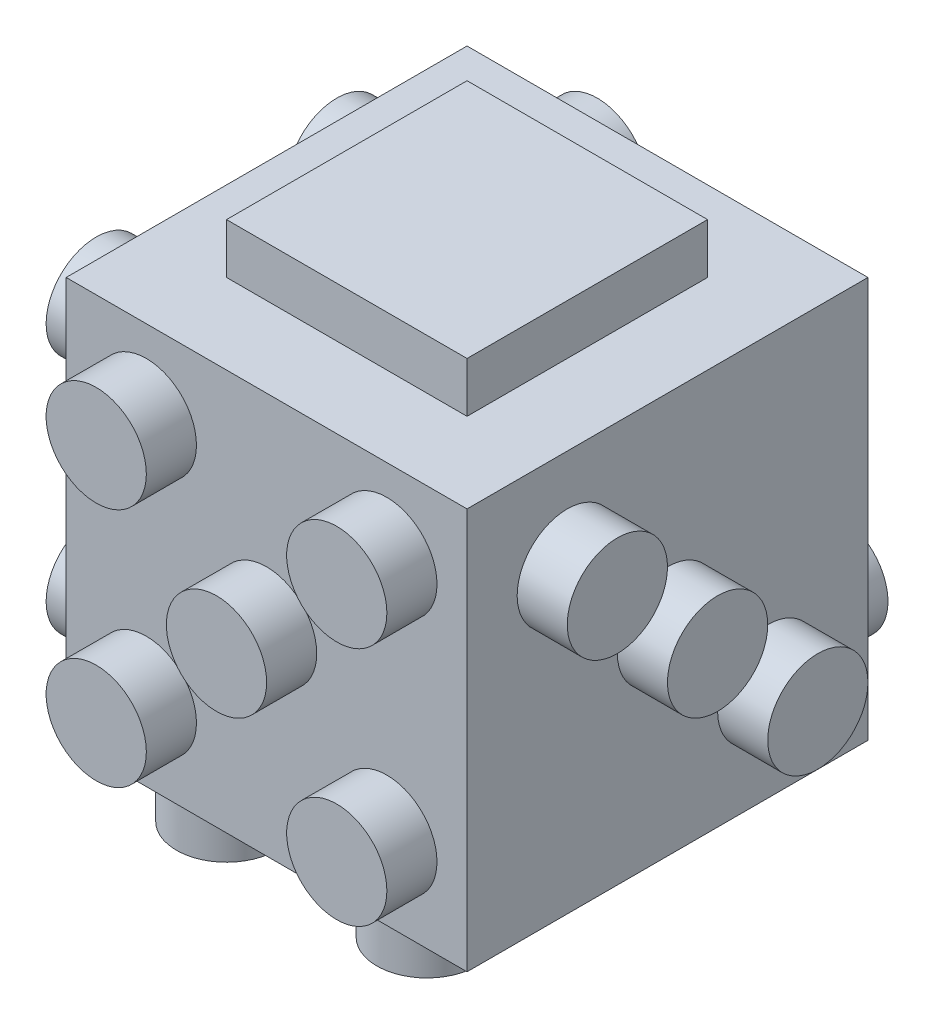
ISO-10303-21;
HEADER;
FILE_DESCRIPTION(('STEP AP214'),'2;1');
FILE_NAME('part.step','',(''),(''),'','','');
FILE_SCHEMA(('AUTOMOTIVE_DESIGN { 1 0 10303 214 1 1 1 1 }'));
ENDSEC;
DATA;
#1=APPLICATION_CONTEXT('core data for automotive mechanical design processes');
#2=APPLICATION_PROTOCOL_DEFINITION('international standard','automotive_design',2000,#1);
#3=PRODUCT_CONTEXT('',#1,'mechanical');
#4=PRODUCT('Part','Part','',(#3));
#5=PRODUCT_RELATED_PRODUCT_CATEGORY('part','',(#4));
#6=PRODUCT_DEFINITION_FORMATION('','',#4);
#7=PRODUCT_DEFINITION_CONTEXT('part definition',#1,'design');
#8=PRODUCT_DEFINITION('design','',#6,#7);
#9=PRODUCT_DEFINITION_SHAPE('','',#8);
#10=(LENGTH_UNIT() NAMED_UNIT(*) SI_UNIT(.MILLI.,.METRE.));
#11=(NAMED_UNIT(*) PLANE_ANGLE_UNIT() SI_UNIT($,.RADIAN.));
#12=(NAMED_UNIT(*) SI_UNIT($,.STERADIAN.) SOLID_ANGLE_UNIT());
#13=UNCERTAINTY_MEASURE_WITH_UNIT(LENGTH_MEASURE(1.E-05),#10,'distance_accuracy_value','');
#14=(GEOMETRIC_REPRESENTATION_CONTEXT(3) GLOBAL_UNCERTAINTY_ASSIGNED_CONTEXT((#13)) GLOBAL_UNIT_ASSIGNED_CONTEXT((#10,
#11,#12)) REPRESENTATION_CONTEXT('',''));
#15=CARTESIAN_POINT('',(0.,0.,0.));
#16=DIRECTION('',(0.,0.,1.));
#17=DIRECTION('',(1.,0.,0.));
#18=AXIS2_PLACEMENT_3D('',#15,#16,#17);
#19=CARTESIAN_POINT('',(0.,2.5,0.));
#20=DIRECTION('',(0.,1.,0.));
#21=DIRECTION('',(0.,0.,1.));
#22=AXIS2_PLACEMENT_3D('',#19,#20,#21);
#23=PLANE('',#22);
#24=CARTESIAN_POINT('',(5.,2.5,7.));
#25=DIRECTION('',(0.,1.,0.));
#26=DIRECTION('',(0.,0.,1.));
#27=AXIS2_PLACEMENT_3D('',#24,#25,#26);
#28=CIRCLE('',#27,2.5);
#29=CARTESIAN_POINT('',(5.,2.5,9.5));
#30=VERTEX_POINT('',#29);
#31=EDGE_CURVE('E55',#30,#30,#28,.F.);
#32=ORIENTED_EDGE('',*,*,#31,.F.);
#33=EDGE_LOOP('',(#32));
#34=FACE_BOUND('',#33,.T.);
#35=ADVANCED_FACE('F48',(#34),#23,.T.);
#36=CARTESIAN_POINT('',(5.,0.,7.));
#37=DIRECTION('',(0.,-1.,0.));
#38=DIRECTION('',(0.,0.,-1.));
#39=AXIS2_PLACEMENT_3D('',#36,#37,#38);
#40=PLANE('',#39);
#41=CARTESIAN_POINT('',(5.,0.,7.));
#42=DIRECTION('',(0.,-1.,0.));
#43=DIRECTION('',(0.,0.,-1.));
#44=AXIS2_PLACEMENT_3D('',#41,#42,#43);
#45=CIRCLE('',#44,2.5);
#46=CARTESIAN_POINT('',(5.,0.,4.5));
#47=VERTEX_POINT('',#46);
#48=EDGE_CURVE('E11',#47,#47,#45,.T.);
#49=ORIENTED_EDGE('',*,*,#48,.T.);
#50=EDGE_LOOP('',(#49));
#51=FACE_BOUND('',#50,.T.);
#52=ADVANCED_FACE('F50',(#51),#40,.T.);
#53=CARTESIAN_POINT('',(5.,9.57106781186548,7.));
#54=DIRECTION('',(0.,-1.,0.));
#55=DIRECTION('',(0.,0.,-1.));
#56=AXIS2_PLACEMENT_3D('',#53,#54,#55);
#57=CYLINDRICAL_SURFACE('',#56,2.5);
#58=ORIENTED_EDGE('',*,*,#48,.F.);
#59=EDGE_LOOP('',(#58));
#60=FACE_BOUND('',#59,.T.);
#61=ORIENTED_EDGE('',*,*,#31,.T.);
#62=EDGE_LOOP('',(#61));
#63=FACE_BOUND('',#62,.T.);
#64=ADVANCED_FACE('F61',(#60,#63),#57,.T.);
#65=CLOSED_SHELL('',(#35,#52,#64));
#66=MANIFOLD_SOLID_BREP('B2',#65);
#67=CARTESIAN_POINT('',(0.,2.5,0.));
#68=DIRECTION('',(0.,1.,0.));
#69=DIRECTION('',(0.,0.,1.));
#70=AXIS2_PLACEMENT_3D('',#67,#68,#69);
#71=PLANE('',#70);
#72=CARTESIAN_POINT('',(5.,2.5,0.));
#73=DIRECTION('',(0.,1.,0.));
#74=DIRECTION('',(0.,0.,1.));
#75=AXIS2_PLACEMENT_3D('',#72,#73,#74);
#76=CIRCLE('',#75,2.5);
#77=CARTESIAN_POINT('',(5.,2.5,2.5));
#78=VERTEX_POINT('',#77);
#79=EDGE_CURVE('E104',#78,#78,#76,.F.);
#80=ORIENTED_EDGE('',*,*,#79,.F.);
#81=EDGE_LOOP('',(#80));
#82=FACE_BOUND('',#81,.T.);
#83=ADVANCED_FACE('F97',(#82),#71,.T.);
#84=CARTESIAN_POINT('',(5.,0.,0.));
#85=DIRECTION('',(0.,-1.,0.));
#86=DIRECTION('',(0.,0.,-1.));
#87=AXIS2_PLACEMENT_3D('',#84,#85,#86);
#88=PLANE('',#87);
#89=CARTESIAN_POINT('',(5.,0.,0.));
#90=DIRECTION('',(0.,-1.,0.));
#91=DIRECTION('',(0.,0.,-1.));
#92=AXIS2_PLACEMENT_3D('',#89,#90,#91);
#93=CIRCLE('',#92,2.5);
#94=CARTESIAN_POINT('',(5.,0.,-2.5));
#95=VERTEX_POINT('',#94);
#96=EDGE_CURVE('E47',#95,#95,#93,.T.);
#97=ORIENTED_EDGE('',*,*,#96,.T.);
#98=EDGE_LOOP('',(#97));
#99=FACE_BOUND('',#98,.T.);
#100=ADVANCED_FACE('F99',(#99),#88,.T.);
#101=CARTESIAN_POINT('',(5.,9.57106781186548,0.));
#102=DIRECTION('',(0.,-1.,0.));
#103=DIRECTION('',(0.,0.,-1.));
#104=AXIS2_PLACEMENT_3D('',#101,#102,#103);
#105=CYLINDRICAL_SURFACE('',#104,2.5);
#106=ORIENTED_EDGE('',*,*,#96,.F.);
#107=EDGE_LOOP('',(#106));
#108=FACE_BOUND('',#107,.T.);
#109=ORIENTED_EDGE('',*,*,#79,.T.);
#110=EDGE_LOOP('',(#109));
#111=FACE_BOUND('',#110,.T.);
#112=ADVANCED_FACE('F110',(#108,#111),#105,.T.);
#113=CLOSED_SHELL('',(#83,#100,#112));
#114=MANIFOLD_SOLID_BREP('B6',#113);
#115=CARTESIAN_POINT('',(0.,2.5,0.));
#116=DIRECTION('',(0.,1.,0.));
#117=DIRECTION('',(0.,0.,1.));
#118=AXIS2_PLACEMENT_3D('',#115,#116,#117);
#119=PLANE('',#118);
#120=CARTESIAN_POINT('',(5.,2.5,-7.));
#121=DIRECTION('',(0.,1.,0.));
#122=DIRECTION('',(0.,0.,1.));
#123=AXIS2_PLACEMENT_3D('',#120,#121,#122);
#124=CIRCLE('',#123,2.5);
#125=CARTESIAN_POINT('',(5.,2.5,-4.5));
#126=VERTEX_POINT('',#125);
#127=EDGE_CURVE('E153',#126,#126,#124,.F.);
#128=ORIENTED_EDGE('',*,*,#127,.F.);
#129=EDGE_LOOP('',(#128));
#130=FACE_BOUND('',#129,.T.);
#131=ADVANCED_FACE('F146',(#130),#119,.T.);
#132=CARTESIAN_POINT('',(5.,0.,-7.));
#133=DIRECTION('',(0.,-1.,0.));
#134=DIRECTION('',(0.,0.,-1.));
#135=AXIS2_PLACEMENT_3D('',#132,#133,#134);
#136=PLANE('',#135);
#137=CARTESIAN_POINT('',(5.,0.,-7.));
#138=DIRECTION('',(0.,-1.,0.));
#139=DIRECTION('',(0.,0.,-1.));
#140=AXIS2_PLACEMENT_3D('',#137,#138,#139);
#141=CIRCLE('',#140,2.5);
#142=CARTESIAN_POINT('',(5.,0.,-9.5));
#143=VERTEX_POINT('',#142);
#144=EDGE_CURVE('E96',#143,#143,#141,.T.);
#145=ORIENTED_EDGE('',*,*,#144,.T.);
#146=EDGE_LOOP('',(#145));
#147=FACE_BOUND('',#146,.T.);
#148=ADVANCED_FACE('F148',(#147),#136,.T.);
#149=CARTESIAN_POINT('',(5.,9.57106781186548,-7.));
#150=DIRECTION('',(0.,-1.,0.));
#151=DIRECTION('',(0.,0.,-1.));
#152=AXIS2_PLACEMENT_3D('',#149,#150,#151);
#153=CYLINDRICAL_SURFACE('',#152,2.5);
#154=ORIENTED_EDGE('',*,*,#144,.F.);
#155=EDGE_LOOP('',(#154));
#156=FACE_BOUND('',#155,.T.);
#157=ORIENTED_EDGE('',*,*,#127,.T.);
#158=EDGE_LOOP('',(#157));
#159=FACE_BOUND('',#158,.T.);
#160=ADVANCED_FACE('F159',(#156,#159),#153,.T.);
#161=CLOSED_SHELL('',(#131,#148,#160));
#162=MANIFOLD_SOLID_BREP('B42',#161);
#163=CARTESIAN_POINT('',(0.,2.5,0.));
#164=DIRECTION('',(0.,1.,0.));
#165=DIRECTION('',(0.,0.,1.));
#166=AXIS2_PLACEMENT_3D('',#163,#164,#165);
#167=PLANE('',#166);
#168=CARTESIAN_POINT('',(-5.,2.5,7.));
#169=DIRECTION('',(0.,1.,0.));
#170=DIRECTION('',(0.,0.,1.));
#171=AXIS2_PLACEMENT_3D('',#168,#169,#170);
#172=CIRCLE('',#171,2.5);
#173=CARTESIAN_POINT('',(-5.,2.5,9.5));
#174=VERTEX_POINT('',#173);
#175=EDGE_CURVE('E202',#174,#174,#172,.F.);
#176=ORIENTED_EDGE('',*,*,#175,.F.);
#177=EDGE_LOOP('',(#176));
#178=FACE_BOUND('',#177,.T.);
#179=ADVANCED_FACE('F195',(#178),#167,.T.);
#180=CARTESIAN_POINT('',(-5.,0.,7.));
#181=DIRECTION('',(0.,-1.,0.));
#182=DIRECTION('',(0.,0.,-1.));
#183=AXIS2_PLACEMENT_3D('',#180,#181,#182);
#184=PLANE('',#183);
#185=CARTESIAN_POINT('',(-5.,0.,7.));
#186=DIRECTION('',(0.,-1.,0.));
#187=DIRECTION('',(0.,0.,-1.));
#188=AXIS2_PLACEMENT_3D('',#185,#186,#187);
#189=CIRCLE('',#188,2.5);
#190=CARTESIAN_POINT('',(-5.,0.,4.5));
#191=VERTEX_POINT('',#190);
#192=EDGE_CURVE('E145',#191,#191,#189,.T.);
#193=ORIENTED_EDGE('',*,*,#192,.T.);
#194=EDGE_LOOP('',(#193));
#195=FACE_BOUND('',#194,.T.);
#196=ADVANCED_FACE('F197',(#195),#184,.T.);
#197=CARTESIAN_POINT('',(-5.,9.57106781186548,7.));
#198=DIRECTION('',(0.,-1.,0.));
#199=DIRECTION('',(0.,0.,-1.));
#200=AXIS2_PLACEMENT_3D('',#197,#198,#199);
#201=CYLINDRICAL_SURFACE('',#200,2.5);
#202=ORIENTED_EDGE('',*,*,#192,.F.);
#203=EDGE_LOOP('',(#202));
#204=FACE_BOUND('',#203,.T.);
#205=ORIENTED_EDGE('',*,*,#175,.T.);
#206=EDGE_LOOP('',(#205));
#207=FACE_BOUND('',#206,.T.);
#208=ADVANCED_FACE('F208',(#204,#207),#201,.T.);
#209=CLOSED_SHELL('',(#179,#196,#208));
#210=MANIFOLD_SOLID_BREP('B91',#209);
#211=CARTESIAN_POINT('',(0.,2.5,0.));
#212=DIRECTION('',(0.,1.,0.));
#213=DIRECTION('',(0.,0.,1.));
#214=AXIS2_PLACEMENT_3D('',#211,#212,#213);
#215=PLANE('',#214);
#216=CARTESIAN_POINT('',(-5.,2.5,0.));
#217=DIRECTION('',(0.,1.,0.));
#218=DIRECTION('',(0.,0.,1.));
#219=AXIS2_PLACEMENT_3D('',#216,#217,#218);
#220=CIRCLE('',#219,2.5);
#221=CARTESIAN_POINT('',(-5.,2.5,2.5));
#222=VERTEX_POINT('',#221);
#223=EDGE_CURVE('E251',#222,#222,#220,.F.);
#224=ORIENTED_EDGE('',*,*,#223,.F.);
#225=EDGE_LOOP('',(#224));
#226=FACE_BOUND('',#225,.T.);
#227=ADVANCED_FACE('F244',(#226),#215,.T.);
#228=CARTESIAN_POINT('',(-5.,0.,0.));
#229=DIRECTION('',(0.,-1.,0.));
#230=DIRECTION('',(0.,0.,-1.));
#231=AXIS2_PLACEMENT_3D('',#228,#229,#230);
#232=PLANE('',#231);
#233=CARTESIAN_POINT('',(-5.,0.,0.));
#234=DIRECTION('',(0.,-1.,0.));
#235=DIRECTION('',(0.,0.,-1.));
#236=AXIS2_PLACEMENT_3D('',#233,#234,#235);
#237=CIRCLE('',#236,2.5);
#238=CARTESIAN_POINT('',(-5.,0.,-2.5));
#239=VERTEX_POINT('',#238);
#240=EDGE_CURVE('E194',#239,#239,#237,.T.);
#241=ORIENTED_EDGE('',*,*,#240,.T.);
#242=EDGE_LOOP('',(#241));
#243=FACE_BOUND('',#242,.T.);
#244=ADVANCED_FACE('F246',(#243),#232,.T.);
#245=CARTESIAN_POINT('',(-5.,9.57106781186548,0.));
#246=DIRECTION('',(0.,-1.,0.));
#247=DIRECTION('',(0.,0.,-1.));
#248=AXIS2_PLACEMENT_3D('',#245,#246,#247);
#249=CYLINDRICAL_SURFACE('',#248,2.5);
#250=ORIENTED_EDGE('',*,*,#240,.F.);
#251=EDGE_LOOP('',(#250));
#252=FACE_BOUND('',#251,.T.);
#253=ORIENTED_EDGE('',*,*,#223,.T.);
#254=EDGE_LOOP('',(#253));
#255=FACE_BOUND('',#254,.T.);
#256=ADVANCED_FACE('F257',(#252,#255),#249,.T.);
#257=CLOSED_SHELL('',(#227,#244,#256));
#258=MANIFOLD_SOLID_BREP('B140',#257);
#259=CARTESIAN_POINT('',(0.,2.5,0.));
#260=DIRECTION('',(0.,1.,0.));
#261=DIRECTION('',(0.,0.,1.));
#262=AXIS2_PLACEMENT_3D('',#259,#260,#261);
#263=PLANE('',#262);
#264=CARTESIAN_POINT('',(-5.,2.5,-7.));
#265=DIRECTION('',(0.,1.,0.));
#266=DIRECTION('',(0.,0.,1.));
#267=AXIS2_PLACEMENT_3D('',#264,#265,#266);
#268=CIRCLE('',#267,2.5);
#269=CARTESIAN_POINT('',(-5.,2.5,-4.5));
#270=VERTEX_POINT('',#269);
#271=EDGE_CURVE('E243',#270,#270,#268,.F.);
#272=ORIENTED_EDGE('',*,*,#271,.F.);
#273=EDGE_LOOP('',(#272));
#274=FACE_BOUND('',#273,.T.);
#275=ADVANCED_FACE('F294',(#274),#263,.T.);
#276=CARTESIAN_POINT('',(-5.,0.,-7.));
#277=DIRECTION('',(0.,-1.,0.));
#278=DIRECTION('',(0.,0.,-1.));
#279=AXIS2_PLACEMENT_3D('',#276,#277,#278);
#280=PLANE('',#279);
#281=CARTESIAN_POINT('',(-5.,0.,-7.));
#282=DIRECTION('',(0.,-1.,0.));
#283=DIRECTION('',(0.,0.,-1.));
#284=AXIS2_PLACEMENT_3D('',#281,#282,#283);
#285=CIRCLE('',#284,2.5);
#286=CARTESIAN_POINT('',(-5.,0.,-9.5));
#287=VERTEX_POINT('',#286);
#288=EDGE_CURVE('E300',#287,#287,#285,.T.);
#289=ORIENTED_EDGE('',*,*,#288,.T.);
#290=EDGE_LOOP('',(#289));
#291=FACE_BOUND('',#290,.T.);
#292=ADVANCED_FACE('F306',(#291),#280,.T.);
#293=CARTESIAN_POINT('',(-5.,9.57106781186548,-7.));
#294=DIRECTION('',(0.,-1.,0.));
#295=DIRECTION('',(0.,0.,-1.));
#296=AXIS2_PLACEMENT_3D('',#293,#294,#295);
#297=CYLINDRICAL_SURFACE('',#296,2.5);
#298=ORIENTED_EDGE('',*,*,#288,.F.);
#299=EDGE_LOOP('',(#298));
#300=FACE_BOUND('',#299,.T.);
#301=ORIENTED_EDGE('',*,*,#271,.T.);
#302=EDGE_LOOP('',(#301));
#303=FACE_BOUND('',#302,.T.);
#304=ADVANCED_FACE('F308',(#300,#303),#297,.T.);
#305=CLOSED_SHELL('',(#275,#292,#304));
#306=MANIFOLD_SOLID_BREP('B189',#305);
#307=CARTESIAN_POINT('',(10.,22.5,-10.));
#308=DIRECTION('',(-1.,0.,0.));
#309=DIRECTION('',(0.,0.,1.));
#310=AXIS2_PLACEMENT_3D('',#307,#308,#309);
#311=PLANE('',#310);
#312=CARTESIAN_POINT('',(10.,17.5,5.));
#313=DIRECTION('',(-1.,0.,0.));
#314=DIRECTION('',(0.,0.,1.));
#315=AXIS2_PLACEMENT_3D('',#312,#313,#314);
#316=CIRCLE('',#315,2.5);
#317=CARTESIAN_POINT('',(10.,17.5,7.5));
#318=VERTEX_POINT('',#317);
#319=EDGE_CURVE('E460',#318,#318,#316,.F.);
#320=ORIENTED_EDGE('',*,*,#319,.F.);
#321=EDGE_LOOP('',(#320));
#322=FACE_BOUND('',#321,.T.);
#323=CARTESIAN_POINT('',(10.,12.5,0.));
#324=DIRECTION('',(-1.,0.,0.));
#325=DIRECTION('',(0.,0.,1.));
#326=AXIS2_PLACEMENT_3D('',#323,#324,#325);
#327=CIRCLE('',#326,2.5);
#328=CARTESIAN_POINT('',(10.,12.5,2.5));
#329=VERTEX_POINT('',#328);
#330=EDGE_CURVE('E468',#329,#329,#327,.F.);
#331=ORIENTED_EDGE('',*,*,#330,.F.);
#332=EDGE_LOOP('',(#331));
#333=FACE_BOUND('',#332,.T.);
#334=CARTESIAN_POINT('',(10.,7.50000000000005,-5.));
#335=DIRECTION('',(-1.,0.,0.));
#336=DIRECTION('',(0.,0.,1.));
#337=AXIS2_PLACEMENT_3D('',#334,#335,#336);
#338=CIRCLE('',#337,2.5);
#339=CARTESIAN_POINT('',(10.,7.50000000000005,-2.5));
#340=VERTEX_POINT('',#339);
#341=EDGE_CURVE('E480',#340,#340,#338,.F.);
#342=ORIENTED_EDGE('',*,*,#341,.F.);
#343=EDGE_LOOP('',(#342));
#344=FACE_BOUND('',#343,.T.);
#345=DIRECTION('',(0.,0.,-1.));
#346=VECTOR('',#345,1.);
#347=CARTESIAN_POINT('',(10.,2.5,-10.));
#348=LINE('',#347,#346);
#349=CARTESIAN_POINT('',(10.,2.5,10.));
#350=VERTEX_POINT('',#349);
#351=CARTESIAN_POINT('',(10.,2.5,-10.));
#352=VERTEX_POINT('',#351);
#353=EDGE_CURVE('E556',#350,#352,#348,.T.);
#354=ORIENTED_EDGE('',*,*,#353,.T.);
#355=DIRECTION('',(0.,-1.,0.));
#356=VECTOR('',#355,1.);
#357=CARTESIAN_POINT('',(10.,22.5,-10.));
#358=LINE('',#357,#356);
#359=CARTESIAN_POINT('',(10.,22.5,-10.));
#360=VERTEX_POINT('',#359);
#361=EDGE_CURVE('E292',#360,#352,#358,.T.);
#362=ORIENTED_EDGE('',*,*,#361,.F.);
#363=DIRECTION('',(0.,0.,-1.));
#364=VECTOR('',#363,1.);
#365=CARTESIAN_POINT('',(10.,22.5,-10.));
#366=LINE('',#365,#364);
#367=CARTESIAN_POINT('',(10.,22.5,10.));
#368=VERTEX_POINT('',#367);
#369=EDGE_CURVE('E557',#368,#360,#366,.T.);
#370=ORIENTED_EDGE('',*,*,#369,.F.);
#371=DIRECTION('',(0.,-1.,0.));
#372=VECTOR('',#371,1.);
#373=CARTESIAN_POINT('',(10.,22.5,10.));
#374=LINE('',#373,#372);
#375=EDGE_CURVE('E571',#368,#350,#374,.T.);
#376=ORIENTED_EDGE('',*,*,#375,.T.);
#377=EDGE_LOOP('',(#354,#362,#370,#376));
#378=FACE_BOUND('',#377,.T.);
#379=ADVANCED_FACE('F335',(#322,#333,#344,#378),#311,.F.);
#380=CARTESIAN_POINT('',(-10.,22.5,-10.));
#381=DIRECTION('',(0.,0.,1.));
#382=DIRECTION('',(1.,0.,0.));
#383=AXIS2_PLACEMENT_3D('',#380,#381,#382);
#384=PLANE('',#383);
#385=CARTESIAN_POINT('',(-6.,18.5,-10.));
#386=DIRECTION('',(0.,0.,1.));
#387=DIRECTION('',(1.,0.,0.));
#388=AXIS2_PLACEMENT_3D('',#385,#386,#387);
#389=CIRCLE('',#388,2.5);
#390=CARTESIAN_POINT('',(-3.5,18.5,-10.));
#391=VERTEX_POINT('',#390);
#392=EDGE_CURVE('E444',#391,#391,#389,.F.);
#393=ORIENTED_EDGE('',*,*,#392,.F.);
#394=EDGE_LOOP('',(#393));
#395=FACE_BOUND('',#394,.T.);
#396=CARTESIAN_POINT('',(6.,6.5,-10.));
#397=DIRECTION('',(0.,0.,1.));
#398=DIRECTION('',(1.,0.,0.));
#399=AXIS2_PLACEMENT_3D('',#396,#397,#398);
#400=CIRCLE('',#399,2.5);
#401=CARTESIAN_POINT('',(8.5,6.5,-10.));
#402=VERTEX_POINT('',#401);
#403=EDGE_CURVE('E456',#402,#402,#400,.F.);
#404=ORIENTED_EDGE('',*,*,#403,.F.);
#405=EDGE_LOOP('',(#404));
#406=FACE_BOUND('',#405,.T.);
#407=DIRECTION('',(-1.,0.,0.));
#408=VECTOR('',#407,1.);
#409=CARTESIAN_POINT('',(-10.,2.5,-10.));
#410=LINE('',#409,#408);
#411=CARTESIAN_POINT('',(-10.,2.5,-10.));
#412=VERTEX_POINT('',#411);
#413=EDGE_CURVE('E575',#352,#412,#410,.T.);
#414=ORIENTED_EDGE('',*,*,#413,.T.);
#415=DIRECTION('',(0.,-1.,0.));
#416=VECTOR('',#415,1.);
#417=CARTESIAN_POINT('',(-10.,22.5,-10.));
#418=LINE('',#417,#416);
#419=CARTESIAN_POINT('',(-10.,22.5,-10.));
#420=VERTEX_POINT('',#419);
#421=EDGE_CURVE('E343',#420,#412,#418,.T.);
#422=ORIENTED_EDGE('',*,*,#421,.F.);
#423=DIRECTION('',(-1.,0.,0.));
#424=VECTOR('',#423,1.);
#425=CARTESIAN_POINT('',(-10.,22.5,-10.));
#426=LINE('',#425,#424);
#427=EDGE_CURVE('E561',#360,#420,#426,.T.);
#428=ORIENTED_EDGE('',*,*,#427,.F.);
#429=ORIENTED_EDGE('',*,*,#361,.T.);
#430=EDGE_LOOP('',(#414,#422,#428,#429));
#431=FACE_BOUND('',#430,.T.);
#432=ADVANCED_FACE('F611',(#395,#406,#431),#384,.F.);
#433=CARTESIAN_POINT('',(-10.,22.5,-10.));
#434=DIRECTION('',(1.,0.,0.));
#435=DIRECTION('',(0.,0.,-1.));
#436=AXIS2_PLACEMENT_3D('',#433,#434,#435);
#437=PLANE('',#436);
#438=CARTESIAN_POINT('',(-10.,18.5,-6.));
#439=DIRECTION('',(1.,0.,0.));
#440=DIRECTION('',(0.,0.,-1.));
#441=AXIS2_PLACEMENT_3D('',#438,#439,#440);
#442=CIRCLE('',#441,2.5);
#443=CARTESIAN_POINT('',(-10.,18.5,-8.5));
#444=VERTEX_POINT('',#443);
#445=EDGE_CURVE('E484',#444,#444,#442,.F.);
#446=ORIENTED_EDGE('',*,*,#445,.F.);
#447=EDGE_LOOP('',(#446));
#448=FACE_BOUND('',#447,.T.);
#449=CARTESIAN_POINT('',(-10.,18.5,6.));
#450=DIRECTION('',(1.,0.,0.));
#451=DIRECTION('',(0.,0.,-1.));
#452=AXIS2_PLACEMENT_3D('',#449,#450,#451);
#453=CIRCLE('',#452,2.5);
#454=CARTESIAN_POINT('',(-10.,18.5,3.5));
#455=VERTEX_POINT('',#454);
#456=EDGE_CURVE('E492',#455,#455,#453,.F.);
#457=ORIENTED_EDGE('',*,*,#456,.F.);
#458=EDGE_LOOP('',(#457));
#459=FACE_BOUND('',#458,.T.);
#460=CARTESIAN_POINT('',(-10.,6.5,6.));
#461=DIRECTION('',(1.,0.,0.));
#462=DIRECTION('',(0.,0.,-1.));
#463=AXIS2_PLACEMENT_3D('',#460,#461,#462);
#464=CIRCLE('',#463,2.5);
#465=CARTESIAN_POINT('',(-10.,6.5,3.5));
#466=VERTEX_POINT('',#465);
#467=EDGE_CURVE('E500',#466,#466,#464,.F.);
#468=ORIENTED_EDGE('',*,*,#467,.F.);
#469=EDGE_LOOP('',(#468));
#470=FACE_BOUND('',#469,.T.);
#471=CARTESIAN_POINT('',(-10.,6.5,-6.));
#472=DIRECTION('',(1.,0.,0.));
#473=DIRECTION('',(0.,0.,-1.));
#474=AXIS2_PLACEMENT_3D('',#471,#472,#473);
#475=CIRCLE('',#474,2.5);
#476=CARTESIAN_POINT('',(-10.,6.5,-8.5));
#477=VERTEX_POINT('',#476);
#478=EDGE_CURVE('E512',#477,#477,#475,.F.);
#479=ORIENTED_EDGE('',*,*,#478,.F.);
#480=EDGE_LOOP('',(#479));
#481=FACE_BOUND('',#480,.T.);
#482=DIRECTION('',(0.,0.,1.));
#483=VECTOR('',#482,1.);
#484=CARTESIAN_POINT('',(-10.,2.5,-10.));
#485=LINE('',#484,#483);
#486=CARTESIAN_POINT('',(-10.,2.5,10.));
#487=VERTEX_POINT('',#486);
#488=EDGE_CURVE('E578',#412,#487,#485,.T.);
#489=ORIENTED_EDGE('',*,*,#488,.T.);
#490=DIRECTION('',(0.,-1.,0.));
#491=VECTOR('',#490,1.);
#492=CARTESIAN_POINT('',(-10.,22.5,10.));
#493=LINE('',#492,#491);
#494=CARTESIAN_POINT('',(-10.,22.5,10.));
#495=VERTEX_POINT('',#494);
#496=EDGE_CURVE('E586',#495,#487,#493,.T.);
#497=ORIENTED_EDGE('',*,*,#496,.F.);
#498=DIRECTION('',(0.,0.,1.));
#499=VECTOR('',#498,1.);
#500=CARTESIAN_POINT('',(-10.,22.5,-10.));
#501=LINE('',#500,#499);
#502=EDGE_CURVE('E565',#420,#495,#501,.T.);
#503=ORIENTED_EDGE('',*,*,#502,.F.);
#504=ORIENTED_EDGE('',*,*,#421,.T.);
#505=EDGE_LOOP('',(#489,#497,#503,#504));
#506=FACE_BOUND('',#505,.T.);
#507=ADVANCED_FACE('F595',(#448,#459,#470,#481,#506),#437,.F.);
#508=CARTESIAN_POINT('',(-10.,22.5,10.));
#509=DIRECTION('',(0.,0.,-1.));
#510=DIRECTION('',(-1.,0.,0.));
#511=AXIS2_PLACEMENT_3D('',#508,#509,#510);
#512=PLANE('',#511);
#513=CARTESIAN_POINT('',(5.99999999999999,6.5,10.));
#514=DIRECTION('',(0.,0.,-1.));
#515=DIRECTION('',(-1.,0.,0.));
#516=AXIS2_PLACEMENT_3D('',#513,#514,#515);
#517=CIRCLE('',#516,2.5);
#518=CARTESIAN_POINT('',(3.5,6.5,10.));
#519=VERTEX_POINT('',#518);
#520=EDGE_CURVE('E516',#519,#519,#517,.F.);
#521=ORIENTED_EDGE('',*,*,#520,.F.);
#522=EDGE_LOOP('',(#521));
#523=FACE_BOUND('',#522,.T.);
#524=CARTESIAN_POINT('',(-6.00000000000001,6.5,10.));
#525=DIRECTION('',(0.,0.,-1.));
#526=DIRECTION('',(-1.,0.,0.));
#527=AXIS2_PLACEMENT_3D('',#524,#525,#526);
#528=CIRCLE('',#527,2.5);
#529=CARTESIAN_POINT('',(-8.50000000000001,6.5,10.));
#530=VERTEX_POINT('',#529);
#531=EDGE_CURVE('E524',#530,#530,#528,.F.);
#532=ORIENTED_EDGE('',*,*,#531,.F.);
#533=EDGE_LOOP('',(#532));
#534=FACE_BOUND('',#533,.T.);
#535=CARTESIAN_POINT('',(0.,12.5,10.));
#536=DIRECTION('',(0.,0.,-1.));
#537=DIRECTION('',(-1.,0.,0.));
#538=AXIS2_PLACEMENT_3D('',#535,#536,#537);
#539=CIRCLE('',#538,2.5);
#540=CARTESIAN_POINT('',(-2.5,12.5,10.));
#541=VERTEX_POINT('',#540);
#542=EDGE_CURVE('E532',#541,#541,#539,.F.);
#543=ORIENTED_EDGE('',*,*,#542,.F.);
#544=EDGE_LOOP('',(#543));
#545=FACE_BOUND('',#544,.T.);
#546=CARTESIAN_POINT('',(5.99999999999999,18.5,10.));
#547=DIRECTION('',(0.,0.,-1.));
#548=DIRECTION('',(-1.,0.,0.));
#549=AXIS2_PLACEMENT_3D('',#546,#547,#548);
#550=CIRCLE('',#549,2.5);
#551=CARTESIAN_POINT('',(3.5,18.5,10.));
#552=VERTEX_POINT('',#551);
#553=EDGE_CURVE('E540',#552,#552,#550,.F.);
#554=ORIENTED_EDGE('',*,*,#553,.F.);
#555=EDGE_LOOP('',(#554));
#556=FACE_BOUND('',#555,.T.);
#557=CARTESIAN_POINT('',(-6.00000000000001,18.5,10.));
#558=DIRECTION('',(0.,0.,-1.));
#559=DIRECTION('',(-1.,0.,0.));
#560=AXIS2_PLACEMENT_3D('',#557,#558,#559);
#561=CIRCLE('',#560,2.5);
#562=CARTESIAN_POINT('',(-8.50000000000001,18.5,10.));
#563=VERTEX_POINT('',#562);
#564=EDGE_CURVE('E552',#563,#563,#561,.F.);
#565=ORIENTED_EDGE('',*,*,#564,.F.);
#566=EDGE_LOOP('',(#565));
#567=FACE_BOUND('',#566,.T.);
#568=DIRECTION('',(1.,0.,0.));
#569=VECTOR('',#568,1.);
#570=CARTESIAN_POINT('',(-10.,2.5,10.));
#571=LINE('',#570,#569);
#572=EDGE_CURVE('E562',#487,#350,#571,.T.);
#573=ORIENTED_EDGE('',*,*,#572,.T.);
#574=ORIENTED_EDGE('',*,*,#375,.F.);
#575=DIRECTION('',(1.,0.,0.));
#576=VECTOR('',#575,1.);
#577=CARTESIAN_POINT('',(-10.,22.5,10.));
#578=LINE('',#577,#576);
#579=EDGE_CURVE('E568',#495,#368,#578,.T.);
#580=ORIENTED_EDGE('',*,*,#579,.F.);
#581=ORIENTED_EDGE('',*,*,#496,.T.);
#582=EDGE_LOOP('',(#573,#574,#580,#581));
#583=FACE_BOUND('',#582,.T.);
#584=ADVANCED_FACE('F604',(#523,#534,#545,#556,#567,#583),#512,.F.);
#585=CARTESIAN_POINT('',(0.,22.5,0.));
#586=DIRECTION('',(0.,1.,0.));
#587=DIRECTION('',(0.,0.,1.));
#588=AXIS2_PLACEMENT_3D('',#585,#586,#587);
#589=PLANE('',#588);
#590=DIRECTION('',(0.,0.,-1.));
#591=VECTOR('',#590,1.);
#592=CARTESIAN_POINT('',(6.,22.5,-6.));
#593=LINE('',#592,#591);
#594=CARTESIAN_POINT('',(6.,22.5,6.));
#595=VERTEX_POINT('',#594);
#596=CARTESIAN_POINT('',(6.,22.5,-6.));
#597=VERTEX_POINT('',#596);
#598=EDGE_CURVE('E350',#595,#597,#593,.T.);
#599=ORIENTED_EDGE('',*,*,#598,.F.);
#600=DIRECTION('',(-1.,0.,0.));
#601=VECTOR('',#600,1.);
#602=CARTESIAN_POINT('',(-6.,22.5,6.));
#603=LINE('',#602,#601);
#604=CARTESIAN_POINT('',(-6.,22.5,6.));
#605=VERTEX_POINT('',#604);
#606=EDGE_CURVE('E354',#595,#605,#603,.T.);
#607=ORIENTED_EDGE('',*,*,#606,.T.);
#608=DIRECTION('',(0.,0.,-1.));
#609=VECTOR('',#608,1.);
#610=CARTESIAN_POINT('',(-6.,22.5,-6.));
#611=LINE('',#610,#609);
#612=CARTESIAN_POINT('',(-6.,22.5,-6.));
#613=VERTEX_POINT('',#612);
#614=EDGE_CURVE('E441',#605,#613,#611,.T.);
#615=ORIENTED_EDGE('',*,*,#614,.T.);
#616=DIRECTION('',(-1.,0.,0.));
#617=VECTOR('',#616,1.);
#618=CARTESIAN_POINT('',(-6.,22.5,-6.));
#619=LINE('',#618,#617);
#620=EDGE_CURVE('E426',#597,#613,#619,.T.);
#621=ORIENTED_EDGE('',*,*,#620,.F.);
#622=EDGE_LOOP('',(#599,#607,#615,#621));
#623=FACE_BOUND('',#622,.T.);
#624=ORIENTED_EDGE('',*,*,#369,.T.);
#625=ORIENTED_EDGE('',*,*,#427,.T.);
#626=ORIENTED_EDGE('',*,*,#502,.T.);
#627=ORIENTED_EDGE('',*,*,#579,.T.);
#628=EDGE_LOOP('',(#624,#625,#626,#627));
#629=FACE_BOUND('',#628,.T.);
#630=ADVANCED_FACE('F610',(#623,#629),#589,.T.);
#631=CARTESIAN_POINT('',(0.,2.5,0.));
#632=DIRECTION('',(0.,1.,0.));
#633=DIRECTION('',(0.,0.,1.));
#634=AXIS2_PLACEMENT_3D('',#631,#632,#633);
#635=PLANE('',#634);
#636=ORIENTED_EDGE('',*,*,#353,.F.);
#637=ORIENTED_EDGE('',*,*,#572,.F.);
#638=ORIENTED_EDGE('',*,*,#488,.F.);
#639=ORIENTED_EDGE('',*,*,#413,.F.);
#640=EDGE_LOOP('',(#636,#637,#638,#639));
#641=FACE_BOUND('',#640,.T.);
#642=ADVANCED_FACE('F601',(#641),#635,.F.);
#643=CARTESIAN_POINT('',(-6.00000000000001,18.5,12.5));
#644=DIRECTION('',(0.,0.,1.));
#645=DIRECTION('',(1.,0.,0.));
#646=AXIS2_PLACEMENT_3D('',#643,#644,#645);
#647=PLANE('',#646);
#648=CARTESIAN_POINT('',(-6.00000000000001,18.5,12.5));
#649=DIRECTION('',(0.,0.,1.));
#650=DIRECTION('',(1.,0.,0.));
#651=AXIS2_PLACEMENT_3D('',#648,#649,#650);
#652=CIRCLE('',#651,2.5);
#653=CARTESIAN_POINT('',(-3.50000000000001,18.5,12.5));
#654=VERTEX_POINT('',#653);
#655=EDGE_CURVE('E548',#654,#654,#652,.T.);
#656=ORIENTED_EDGE('',*,*,#655,.T.);
#657=EDGE_LOOP('',(#656));
#658=FACE_BOUND('',#657,.T.);
#659=ADVANCED_FACE('F629',(#658),#647,.T.);
#660=CARTESIAN_POINT('',(-6.00000000000001,18.5,2.92893218813452));
#661=DIRECTION('',(0.,0.,1.));
#662=DIRECTION('',(1.,0.,0.));
#663=AXIS2_PLACEMENT_3D('',#660,#661,#662);
#664=CYLINDRICAL_SURFACE('',#663,2.5);
#665=ORIENTED_EDGE('',*,*,#655,.F.);
#666=EDGE_LOOP('',(#665));
#667=FACE_BOUND('',#666,.T.);
#668=ORIENTED_EDGE('',*,*,#564,.T.);
#669=EDGE_LOOP('',(#668));
#670=FACE_BOUND('',#669,.T.);
#671=ADVANCED_FACE('F632',(#667,#670),#664,.T.);
#672=CARTESIAN_POINT('',(5.99999999999999,18.5,12.5));
#673=DIRECTION('',(0.,0.,1.));
#674=DIRECTION('',(1.,0.,0.));
#675=AXIS2_PLACEMENT_3D('',#672,#673,#674);
#676=PLANE('',#675);
#677=CARTESIAN_POINT('',(5.99999999999999,18.5,12.5));
#678=DIRECTION('',(0.,0.,1.));
#679=DIRECTION('',(1.,0.,0.));
#680=AXIS2_PLACEMENT_3D('',#677,#678,#679);
#681=CIRCLE('',#680,2.5);
#682=CARTESIAN_POINT('',(8.49999999999999,18.5,12.5));
#683=VERTEX_POINT('',#682);
#684=EDGE_CURVE('E544',#683,#683,#681,.T.);
#685=ORIENTED_EDGE('',*,*,#684,.T.);
#686=EDGE_LOOP('',(#685));
#687=FACE_BOUND('',#686,.T.);
#688=ADVANCED_FACE('F635',(#687),#676,.T.);
#689=CARTESIAN_POINT('',(5.99999999999999,18.5,2.92893218813452));
#690=DIRECTION('',(0.,0.,1.));
#691=DIRECTION('',(1.,0.,0.));
#692=AXIS2_PLACEMENT_3D('',#689,#690,#691);
#693=CYLINDRICAL_SURFACE('',#692,2.5);
#694=ORIENTED_EDGE('',*,*,#684,.F.);
#695=EDGE_LOOP('',(#694));
#696=FACE_BOUND('',#695,.T.);
#697=ORIENTED_EDGE('',*,*,#553,.T.);
#698=EDGE_LOOP('',(#697));
#699=FACE_BOUND('',#698,.T.);
#700=ADVANCED_FACE('F642',(#696,#699),#693,.T.);
#701=CARTESIAN_POINT('',(0.,12.5,12.5));
#702=DIRECTION('',(0.,0.,1.));
#703=DIRECTION('',(1.,0.,0.));
#704=AXIS2_PLACEMENT_3D('',#701,#702,#703);
#705=PLANE('',#704);
#706=CARTESIAN_POINT('',(0.,12.5,12.5));
#707=DIRECTION('',(0.,0.,1.));
#708=DIRECTION('',(1.,0.,0.));
#709=AXIS2_PLACEMENT_3D('',#706,#707,#708);
#710=CIRCLE('',#709,2.5);
#711=CARTESIAN_POINT('',(2.5,12.5,12.5));
#712=VERTEX_POINT('',#711);
#713=EDGE_CURVE('E536',#712,#712,#710,.T.);
#714=ORIENTED_EDGE('',*,*,#713,.T.);
#715=EDGE_LOOP('',(#714));
#716=FACE_BOUND('',#715,.T.);
#717=ADVANCED_FACE('F646',(#716),#705,.T.);
#718=CARTESIAN_POINT('',(0.,12.5,2.92893218813452));
#719=DIRECTION('',(0.,0.,1.));
#720=DIRECTION('',(1.,0.,0.));
#721=AXIS2_PLACEMENT_3D('',#718,#719,#720);
#722=CYLINDRICAL_SURFACE('',#721,2.5);
#723=ORIENTED_EDGE('',*,*,#713,.F.);
#724=EDGE_LOOP('',(#723));
#725=FACE_BOUND('',#724,.T.);
#726=ORIENTED_EDGE('',*,*,#542,.T.);
#727=EDGE_LOOP('',(#726));
#728=FACE_BOUND('',#727,.T.);
#729=ADVANCED_FACE('F650',(#725,#728),#722,.T.);
#730=CARTESIAN_POINT('',(-6.00000000000001,6.5,12.5));
#731=DIRECTION('',(0.,0.,1.));
#732=DIRECTION('',(1.,0.,0.));
#733=AXIS2_PLACEMENT_3D('',#730,#731,#732);
#734=PLANE('',#733);
#735=CARTESIAN_POINT('',(-6.00000000000001,6.5,12.5));
#736=DIRECTION('',(0.,0.,1.));
#737=DIRECTION('',(1.,0.,0.));
#738=AXIS2_PLACEMENT_3D('',#735,#736,#737);
#739=CIRCLE('',#738,2.5);
#740=CARTESIAN_POINT('',(-3.5,6.5,12.5));
#741=VERTEX_POINT('',#740);
#742=EDGE_CURVE('E528',#741,#741,#739,.T.);
#743=ORIENTED_EDGE('',*,*,#742,.T.);
#744=EDGE_LOOP('',(#743));
#745=FACE_BOUND('',#744,.T.);
#746=ADVANCED_FACE('F654',(#745),#734,.T.);
#747=CARTESIAN_POINT('',(-6.00000000000001,6.5,2.92893218813452));
#748=DIRECTION('',(0.,0.,1.));
#749=DIRECTION('',(1.,0.,0.));
#750=AXIS2_PLACEMENT_3D('',#747,#748,#749);
#751=CYLINDRICAL_SURFACE('',#750,2.5);
#752=ORIENTED_EDGE('',*,*,#742,.F.);
#753=EDGE_LOOP('',(#752));
#754=FACE_BOUND('',#753,.T.);
#755=ORIENTED_EDGE('',*,*,#531,.T.);
#756=EDGE_LOOP('',(#755));
#757=FACE_BOUND('',#756,.T.);
#758=ADVANCED_FACE('F658',(#754,#757),#751,.T.);
#759=CARTESIAN_POINT('',(5.99999999999999,6.5,12.5));
#760=DIRECTION('',(0.,0.,1.));
#761=DIRECTION('',(1.,0.,0.));
#762=AXIS2_PLACEMENT_3D('',#759,#760,#761);
#763=PLANE('',#762);
#764=CARTESIAN_POINT('',(5.99999999999999,6.5,12.5));
#765=DIRECTION('',(0.,0.,1.));
#766=DIRECTION('',(1.,0.,0.));
#767=AXIS2_PLACEMENT_3D('',#764,#765,#766);
#768=CIRCLE('',#767,2.5);
#769=CARTESIAN_POINT('',(8.49999999999999,6.5,12.5));
#770=VERTEX_POINT('',#769);
#771=EDGE_CURVE('E520',#770,#770,#768,.T.);
#772=ORIENTED_EDGE('',*,*,#771,.T.);
#773=EDGE_LOOP('',(#772));
#774=FACE_BOUND('',#773,.T.);
#775=ADVANCED_FACE('F662',(#774),#763,.T.);
#776=CARTESIAN_POINT('',(5.99999999999999,6.5,2.92893218813452));
#777=DIRECTION('',(0.,0.,1.));
#778=DIRECTION('',(1.,0.,0.));
#779=AXIS2_PLACEMENT_3D('',#776,#777,#778);
#780=CYLINDRICAL_SURFACE('',#779,2.5);
#781=ORIENTED_EDGE('',*,*,#771,.F.);
#782=EDGE_LOOP('',(#781));
#783=FACE_BOUND('',#782,.T.);
#784=ORIENTED_EDGE('',*,*,#520,.T.);
#785=EDGE_LOOP('',(#784));
#786=FACE_BOUND('',#785,.T.);
#787=ADVANCED_FACE('F666',(#783,#786),#780,.T.);
#788=CARTESIAN_POINT('',(-12.5,6.5,-6.));
#789=DIRECTION('',(-1.,0.,0.));
#790=DIRECTION('',(0.,0.,1.));
#791=AXIS2_PLACEMENT_3D('',#788,#789,#790);
#792=PLANE('',#791);
#793=CARTESIAN_POINT('',(-12.5,6.5,-6.));
#794=DIRECTION('',(-1.,0.,0.));
#795=DIRECTION('',(0.,0.,1.));
#796=AXIS2_PLACEMENT_3D('',#793,#794,#795);
#797=CIRCLE('',#796,2.5);
#798=CARTESIAN_POINT('',(-12.5,6.5,-3.5));
#799=VERTEX_POINT('',#798);
#800=EDGE_CURVE('E508',#799,#799,#797,.T.);
#801=ORIENTED_EDGE('',*,*,#800,.T.);
#802=EDGE_LOOP('',(#801));
#803=FACE_BOUND('',#802,.T.);
#804=ADVANCED_FACE('F670',(#803),#792,.T.);
#805=CARTESIAN_POINT('',(-2.92893218813452,6.5,-6.));
#806=DIRECTION('',(-1.,0.,0.));
#807=DIRECTION('',(0.,0.,1.));
#808=AXIS2_PLACEMENT_3D('',#805,#806,#807);
#809=CYLINDRICAL_SURFACE('',#808,2.5);
#810=ORIENTED_EDGE('',*,*,#800,.F.);
#811=EDGE_LOOP('',(#810));
#812=FACE_BOUND('',#811,.T.);
#813=ORIENTED_EDGE('',*,*,#478,.T.);
#814=EDGE_LOOP('',(#813));
#815=FACE_BOUND('',#814,.T.);
#816=ADVANCED_FACE('F672',(#812,#815),#809,.T.);
#817=CARTESIAN_POINT('',(-12.5,6.5,6.));
#818=DIRECTION('',(-1.,0.,0.));
#819=DIRECTION('',(0.,0.,1.));
#820=AXIS2_PLACEMENT_3D('',#817,#818,#819);
#821=PLANE('',#820);
#822=CARTESIAN_POINT('',(-12.5,6.5,6.));
#823=DIRECTION('',(-1.,0.,0.));
#824=DIRECTION('',(0.,0.,1.));
#825=AXIS2_PLACEMENT_3D('',#822,#823,#824);
#826=CIRCLE('',#825,2.5);
#827=CARTESIAN_POINT('',(-12.5,6.5,8.5));
#828=VERTEX_POINT('',#827);
#829=EDGE_CURVE('E504',#828,#828,#826,.T.);
#830=ORIENTED_EDGE('',*,*,#829,.T.);
#831=EDGE_LOOP('',(#830));
#832=FACE_BOUND('',#831,.T.);
#833=ADVANCED_FACE('F675',(#832),#821,.T.);
#834=CARTESIAN_POINT('',(-2.92893218813452,6.5,6.));
#835=DIRECTION('',(-1.,0.,0.));
#836=DIRECTION('',(0.,0.,1.));
#837=AXIS2_PLACEMENT_3D('',#834,#835,#836);
#838=CYLINDRICAL_SURFACE('',#837,2.5);
#839=ORIENTED_EDGE('',*,*,#829,.F.);
#840=EDGE_LOOP('',(#839));
#841=FACE_BOUND('',#840,.T.);
#842=ORIENTED_EDGE('',*,*,#467,.T.);
#843=EDGE_LOOP('',(#842));
#844=FACE_BOUND('',#843,.T.);
#845=ADVANCED_FACE('F682',(#841,#844),#838,.T.);
#846=CARTESIAN_POINT('',(-12.5,18.5,6.));
#847=DIRECTION('',(-1.,0.,0.));
#848=DIRECTION('',(0.,0.,1.));
#849=AXIS2_PLACEMENT_3D('',#846,#847,#848);
#850=PLANE('',#849);
#851=CARTESIAN_POINT('',(-12.5,18.5,6.));
#852=DIRECTION('',(-1.,0.,0.));
#853=DIRECTION('',(0.,0.,1.));
#854=AXIS2_PLACEMENT_3D('',#851,#852,#853);
#855=CIRCLE('',#854,2.5);
#856=CARTESIAN_POINT('',(-12.5,18.5,8.5));
#857=VERTEX_POINT('',#856);
#858=EDGE_CURVE('E496',#857,#857,#855,.T.);
#859=ORIENTED_EDGE('',*,*,#858,.T.);
#860=EDGE_LOOP('',(#859));
#861=FACE_BOUND('',#860,.T.);
#862=ADVANCED_FACE('F686',(#861),#850,.T.);
#863=CARTESIAN_POINT('',(-2.92893218813452,18.5,6.));
#864=DIRECTION('',(-1.,0.,0.));
#865=DIRECTION('',(0.,0.,1.));
#866=AXIS2_PLACEMENT_3D('',#863,#864,#865);
#867=CYLINDRICAL_SURFACE('',#866,2.5);
#868=ORIENTED_EDGE('',*,*,#858,.F.);
#869=EDGE_LOOP('',(#868));
#870=FACE_BOUND('',#869,.T.);
#871=ORIENTED_EDGE('',*,*,#456,.T.);
#872=EDGE_LOOP('',(#871));
#873=FACE_BOUND('',#872,.T.);
#874=ADVANCED_FACE('F690',(#870,#873),#867,.T.);
#875=CARTESIAN_POINT('',(-12.5,18.5,-6.));
#876=DIRECTION('',(-1.,0.,0.));
#877=DIRECTION('',(0.,0.,1.));
#878=AXIS2_PLACEMENT_3D('',#875,#876,#877);
#879=PLANE('',#878);
#880=CARTESIAN_POINT('',(-12.5,18.5,-6.));
#881=DIRECTION('',(-1.,0.,0.));
#882=DIRECTION('',(0.,0.,1.));
#883=AXIS2_PLACEMENT_3D('',#880,#881,#882);
#884=CIRCLE('',#883,2.5);
#885=CARTESIAN_POINT('',(-12.5,18.5,-3.5));
#886=VERTEX_POINT('',#885);
#887=EDGE_CURVE('E488',#886,#886,#884,.T.);
#888=ORIENTED_EDGE('',*,*,#887,.T.);
#889=EDGE_LOOP('',(#888));
#890=FACE_BOUND('',#889,.T.);
#891=ADVANCED_FACE('F694',(#890),#879,.T.);
#892=CARTESIAN_POINT('',(-2.92893218813452,18.5,-6.));
#893=DIRECTION('',(-1.,0.,0.));
#894=DIRECTION('',(0.,0.,1.));
#895=AXIS2_PLACEMENT_3D('',#892,#893,#894);
#896=CYLINDRICAL_SURFACE('',#895,2.5);
#897=ORIENTED_EDGE('',*,*,#887,.F.);
#898=EDGE_LOOP('',(#897));
#899=FACE_BOUND('',#898,.T.);
#900=ORIENTED_EDGE('',*,*,#445,.T.);
#901=EDGE_LOOP('',(#900));
#902=FACE_BOUND('',#901,.T.);
#903=ADVANCED_FACE('F698',(#899,#902),#896,.T.);
#904=CARTESIAN_POINT('',(12.5,7.50000000000005,-5.));
#905=DIRECTION('',(1.,0.,0.));
#906=DIRECTION('',(0.,0.,-1.));
#907=AXIS2_PLACEMENT_3D('',#904,#905,#906);
#908=PLANE('',#907);
#909=CARTESIAN_POINT('',(12.5,7.50000000000005,-5.));
#910=DIRECTION('',(1.,0.,0.));
#911=DIRECTION('',(0.,0.,-1.));
#912=AXIS2_PLACEMENT_3D('',#909,#910,#911);
#913=CIRCLE('',#912,2.5);
#914=CARTESIAN_POINT('',(12.5,7.50000000000005,-7.5));
#915=VERTEX_POINT('',#914);
#916=EDGE_CURVE('E476',#915,#915,#913,.T.);
#917=ORIENTED_EDGE('',*,*,#916,.T.);
#918=EDGE_LOOP('',(#917));
#919=FACE_BOUND('',#918,.T.);
#920=ADVANCED_FACE('F702',(#919),#908,.T.);
#921=CARTESIAN_POINT('',(2.92893218813452,7.50000000000005,-5.));
#922=DIRECTION('',(1.,0.,0.));
#923=DIRECTION('',(0.,0.,-1.));
#924=AXIS2_PLACEMENT_3D('',#921,#922,#923);
#925=CYLINDRICAL_SURFACE('',#924,2.5);
#926=ORIENTED_EDGE('',*,*,#916,.F.);
#927=EDGE_LOOP('',(#926));
#928=FACE_BOUND('',#927,.T.);
#929=ORIENTED_EDGE('',*,*,#341,.T.);
#930=EDGE_LOOP('',(#929));
#931=FACE_BOUND('',#930,.T.);
#932=ADVANCED_FACE('F704',(#928,#931),#925,.T.);
#933=CARTESIAN_POINT('',(12.5,12.5,0.));
#934=DIRECTION('',(1.,0.,0.));
#935=DIRECTION('',(0.,0.,-1.));
#936=AXIS2_PLACEMENT_3D('',#933,#934,#935);
#937=PLANE('',#936);
#938=CARTESIAN_POINT('',(12.5,12.5,0.));
#939=DIRECTION('',(1.,0.,0.));
#940=DIRECTION('',(0.,0.,-1.));
#941=AXIS2_PLACEMENT_3D('',#938,#939,#940);
#942=CIRCLE('',#941,2.5);
#943=CARTESIAN_POINT('',(12.5,12.5,-2.5));
#944=VERTEX_POINT('',#943);
#945=EDGE_CURVE('E472',#944,#944,#942,.T.);
#946=ORIENTED_EDGE('',*,*,#945,.T.);
#947=EDGE_LOOP('',(#946));
#948=FACE_BOUND('',#947,.T.);
#949=ADVANCED_FACE('F707',(#948),#937,.T.);
#950=CARTESIAN_POINT('',(2.92893218813452,12.5,0.));
#951=DIRECTION('',(1.,0.,0.));
#952=DIRECTION('',(0.,0.,-1.));
#953=AXIS2_PLACEMENT_3D('',#950,#951,#952);
#954=CYLINDRICAL_SURFACE('',#953,2.5);
#955=ORIENTED_EDGE('',*,*,#945,.F.);
#956=EDGE_LOOP('',(#955));
#957=FACE_BOUND('',#956,.T.);
#958=ORIENTED_EDGE('',*,*,#330,.T.);
#959=EDGE_LOOP('',(#958));
#960=FACE_BOUND('',#959,.T.);
#961=ADVANCED_FACE('F714',(#957,#960),#954,.T.);
#962=CARTESIAN_POINT('',(12.5,17.5,5.));
#963=DIRECTION('',(1.,0.,0.));
#964=DIRECTION('',(0.,0.,-1.));
#965=AXIS2_PLACEMENT_3D('',#962,#963,#964);
#966=PLANE('',#965);
#967=CARTESIAN_POINT('',(12.5,17.5,5.));
#968=DIRECTION('',(1.,0.,0.));
#969=DIRECTION('',(0.,0.,-1.));
#970=AXIS2_PLACEMENT_3D('',#967,#968,#969);
#971=CIRCLE('',#970,2.5);
#972=CARTESIAN_POINT('',(12.5,17.5,2.5));
#973=VERTEX_POINT('',#972);
#974=EDGE_CURVE('E464',#973,#973,#971,.T.);
#975=ORIENTED_EDGE('',*,*,#974,.T.);
#976=EDGE_LOOP('',(#975));
#977=FACE_BOUND('',#976,.T.);
#978=ADVANCED_FACE('F718',(#977),#966,.T.);
#979=CARTESIAN_POINT('',(2.92893218813452,17.5,5.));
#980=DIRECTION('',(1.,0.,0.));
#981=DIRECTION('',(0.,0.,-1.));
#982=AXIS2_PLACEMENT_3D('',#979,#980,#981);
#983=CYLINDRICAL_SURFACE('',#982,2.5);
#984=ORIENTED_EDGE('',*,*,#974,.F.);
#985=EDGE_LOOP('',(#984));
#986=FACE_BOUND('',#985,.T.);
#987=ORIENTED_EDGE('',*,*,#319,.T.);
#988=EDGE_LOOP('',(#987));
#989=FACE_BOUND('',#988,.T.);
#990=ADVANCED_FACE('F722',(#986,#989),#983,.T.);
#991=CARTESIAN_POINT('',(6.,6.5,-12.5));
#992=DIRECTION('',(0.,0.,-1.));
#993=DIRECTION('',(-1.,0.,0.));
#994=AXIS2_PLACEMENT_3D('',#991,#992,#993);
#995=PLANE('',#994);
#996=CARTESIAN_POINT('',(6.,6.5,-12.5));
#997=DIRECTION('',(0.,0.,-1.));
#998=DIRECTION('',(-1.,0.,0.));
#999=AXIS2_PLACEMENT_3D('',#996,#997,#998);
#1000=CIRCLE('',#999,2.5);
#1001=CARTESIAN_POINT('',(3.5,6.5,-12.5));
#1002=VERTEX_POINT('',#1001);
#1003=EDGE_CURVE('E452',#1002,#1002,#1000,.T.);
#1004=ORIENTED_EDGE('',*,*,#1003,.T.);
#1005=EDGE_LOOP('',(#1004));
#1006=FACE_BOUND('',#1005,.T.);
#1007=ADVANCED_FACE('F726',(#1006),#995,.T.);
#1008=CARTESIAN_POINT('',(6.,6.5,-2.92893218813452));
#1009=DIRECTION('',(0.,0.,-1.));
#1010=DIRECTION('',(-1.,0.,0.));
#1011=AXIS2_PLACEMENT_3D('',#1008,#1009,#1010);
#1012=CYLINDRICAL_SURFACE('',#1011,2.5);
#1013=ORIENTED_EDGE('',*,*,#1003,.F.);
#1014=EDGE_LOOP('',(#1013));
#1015=FACE_BOUND('',#1014,.T.);
#1016=ORIENTED_EDGE('',*,*,#403,.T.);
#1017=EDGE_LOOP('',(#1016));
#1018=FACE_BOUND('',#1017,.T.);
#1019=ADVANCED_FACE('F728',(#1015,#1018),#1012,.T.);
#1020=CARTESIAN_POINT('',(-6.,18.5,-12.5));
#1021=DIRECTION('',(0.,0.,-1.));
#1022=DIRECTION('',(-1.,0.,0.));
#1023=AXIS2_PLACEMENT_3D('',#1020,#1021,#1022);
#1024=PLANE('',#1023);
#1025=CARTESIAN_POINT('',(-6.,18.5,-12.5));
#1026=DIRECTION('',(0.,0.,-1.));
#1027=DIRECTION('',(-1.,0.,0.));
#1028=AXIS2_PLACEMENT_3D('',#1025,#1026,#1027);
#1029=CIRCLE('',#1028,2.5);
#1030=CARTESIAN_POINT('',(-8.5,18.5,-12.5));
#1031=VERTEX_POINT('',#1030);
#1032=EDGE_CURVE('E448',#1031,#1031,#1029,.T.);
#1033=ORIENTED_EDGE('',*,*,#1032,.T.);
#1034=EDGE_LOOP('',(#1033));
#1035=FACE_BOUND('',#1034,.T.);
#1036=ADVANCED_FACE('F731',(#1035),#1024,.T.);
#1037=CARTESIAN_POINT('',(-6.,18.5,-2.92893218813452));
#1038=DIRECTION('',(0.,0.,-1.));
#1039=DIRECTION('',(-1.,0.,0.));
#1040=AXIS2_PLACEMENT_3D('',#1037,#1038,#1039);
#1041=CYLINDRICAL_SURFACE('',#1040,2.5);
#1042=ORIENTED_EDGE('',*,*,#1032,.F.);
#1043=EDGE_LOOP('',(#1042));
#1044=FACE_BOUND('',#1043,.T.);
#1045=ORIENTED_EDGE('',*,*,#392,.T.);
#1046=EDGE_LOOP('',(#1045));
#1047=FACE_BOUND('',#1046,.T.);
#1048=ADVANCED_FACE('F738',(#1044,#1047),#1041,.T.);
#1049=CARTESIAN_POINT('',(-6.,5.52943725152286,-6.));
#1050=DIRECTION('',(0.,0.,1.));
#1051=DIRECTION('',(1.,0.,0.));
#1052=AXIS2_PLACEMENT_3D('',#1049,#1050,#1051);
#1053=PLANE('',#1052);
#1054=DIRECTION('',(0.,1.,0.));
#1055=VECTOR('',#1054,1.);
#1056=CARTESIAN_POINT('',(6.,5.52943725152286,-6.));
#1057=LINE('',#1056,#1055);
#1058=CARTESIAN_POINT('',(6.,25.,-6.));
#1059=VERTEX_POINT('',#1058);
#1060=EDGE_CURVE('E398',#597,#1059,#1057,.T.);
#1061=ORIENTED_EDGE('',*,*,#1060,.F.);
#1062=ORIENTED_EDGE('',*,*,#620,.T.);
#1063=DIRECTION('',(0.,1.,0.));
#1064=VECTOR('',#1063,1.);
#1065=CARTESIAN_POINT('',(-6.,5.52943725152286,-6.));
#1066=LINE('',#1065,#1064);
#1067=CARTESIAN_POINT('',(-6.,25.,-6.));
#1068=VERTEX_POINT('',#1067);
#1069=EDGE_CURVE('E422',#613,#1068,#1066,.T.);
#1070=ORIENTED_EDGE('',*,*,#1069,.T.);
#1071=DIRECTION('',(1.,0.,0.));
#1072=VECTOR('',#1071,1.);
#1073=CARTESIAN_POINT('',(-6.,25.,-6.));
#1074=LINE('',#1073,#1072);
#1075=EDGE_CURVE('E414',#1068,#1059,#1074,.T.);
#1076=ORIENTED_EDGE('',*,*,#1075,.T.);
#1077=EDGE_LOOP('',(#1061,#1062,#1070,#1076));
#1078=FACE_BOUND('',#1077,.T.);
#1079=ADVANCED_FACE('F420',(#1078),#1053,.F.);
#1080=CARTESIAN_POINT('',(6.,5.52943725152286,-6.));
#1081=DIRECTION('',(-1.,0.,0.));
#1082=DIRECTION('',(0.,0.,1.));
#1083=AXIS2_PLACEMENT_3D('',#1080,#1081,#1082);
#1084=PLANE('',#1083);
#1085=DIRECTION('',(0.,1.,0.));
#1086=VECTOR('',#1085,1.);
#1087=CARTESIAN_POINT('',(6.,5.52943725152286,6.));
#1088=LINE('',#1087,#1086);
#1089=CARTESIAN_POINT('',(6.,25.,6.));
#1090=VERTEX_POINT('',#1089);
#1091=EDGE_CURVE('E408',#595,#1090,#1088,.T.);
#1092=ORIENTED_EDGE('',*,*,#1091,.F.);
#1093=ORIENTED_EDGE('',*,*,#598,.T.);
#1094=ORIENTED_EDGE('',*,*,#1060,.T.);
#1095=DIRECTION('',(0.,0.,1.));
#1096=VECTOR('',#1095,1.);
#1097=CARTESIAN_POINT('',(6.,25.,-6.));
#1098=LINE('',#1097,#1096);
#1099=EDGE_CURVE('E402',#1059,#1090,#1098,.T.);
#1100=ORIENTED_EDGE('',*,*,#1099,.T.);
#1101=EDGE_LOOP('',(#1092,#1093,#1094,#1100));
#1102=FACE_BOUND('',#1101,.T.);
#1103=ADVANCED_FACE('F401',(#1102),#1084,.F.);
#1104=CARTESIAN_POINT('',(-6.,5.52943725152286,6.));
#1105=DIRECTION('',(0.,0.,1.));
#1106=DIRECTION('',(1.,0.,0.));
#1107=AXIS2_PLACEMENT_3D('',#1104,#1105,#1106);
#1108=PLANE('',#1107);
#1109=ORIENTED_EDGE('',*,*,#606,.F.);
#1110=ORIENTED_EDGE('',*,*,#1091,.T.);
#1111=DIRECTION('',(1.,0.,0.));
#1112=VECTOR('',#1111,1.);
#1113=CARTESIAN_POINT('',(-6.,25.,6.));
#1114=LINE('',#1113,#1112);
#1115=CARTESIAN_POINT('',(-6.,25.,6.));
#1116=VERTEX_POINT('',#1115);
#1117=EDGE_CURVE('E417',#1116,#1090,#1114,.T.);
#1118=ORIENTED_EDGE('',*,*,#1117,.F.);
#1119=DIRECTION('',(0.,1.,0.));
#1120=VECTOR('',#1119,1.);
#1121=CARTESIAN_POINT('',(-6.,5.52943725152286,6.));
#1122=LINE('',#1121,#1120);
#1123=EDGE_CURVE('E436',#605,#1116,#1122,.T.);
#1124=ORIENTED_EDGE('',*,*,#1123,.F.);
#1125=EDGE_LOOP('',(#1109,#1110,#1118,#1124));
#1126=FACE_BOUND('',#1125,.T.);
#1127=ADVANCED_FACE('F747',(#1126),#1108,.T.);
#1128=CARTESIAN_POINT('',(-6.,5.52943725152286,-6.));
#1129=DIRECTION('',(-1.,0.,0.));
#1130=DIRECTION('',(0.,0.,1.));
#1131=AXIS2_PLACEMENT_3D('',#1128,#1129,#1130);
#1132=PLANE('',#1131);
#1133=ORIENTED_EDGE('',*,*,#614,.F.);
#1134=ORIENTED_EDGE('',*,*,#1123,.T.);
#1135=DIRECTION('',(0.,0.,1.));
#1136=VECTOR('',#1135,1.);
#1137=CARTESIAN_POINT('',(-6.,25.,-6.));
#1138=LINE('',#1137,#1136);
#1139=EDGE_CURVE('E431',#1068,#1116,#1138,.T.);
#1140=ORIENTED_EDGE('',*,*,#1139,.F.);
#1141=ORIENTED_EDGE('',*,*,#1069,.F.);
#1142=EDGE_LOOP('',(#1133,#1134,#1140,#1141));
#1143=FACE_BOUND('',#1142,.T.);
#1144=ADVANCED_FACE('F750',(#1143),#1132,.T.);
#1145=CARTESIAN_POINT('',(0.,25.,0.));
#1146=DIRECTION('',(0.,-1.,0.));
#1147=DIRECTION('',(0.,0.,-1.));
#1148=AXIS2_PLACEMENT_3D('',#1145,#1146,#1147);
#1149=PLANE('',#1148);
#1150=ORIENTED_EDGE('',*,*,#1075,.F.);
#1151=ORIENTED_EDGE('',*,*,#1139,.T.);
#1152=ORIENTED_EDGE('',*,*,#1117,.T.);
#1153=ORIENTED_EDGE('',*,*,#1099,.F.);
#1154=EDGE_LOOP('',(#1150,#1151,#1152,#1153));
#1155=FACE_BOUND('',#1154,.T.);
#1156=ADVANCED_FACE('F412',(#1155),#1149,.F.);
#1157=CLOSED_SHELL('',(#379,#432,#507,#584,#630,#642,#659,#671,#688,#700,#717,#729,#746,#758,
#775,#787,#804,#816,#833,#845,#862,#874,#891,#903,#920,#932,#949,#961,#978,#990,#1007,#1019,
#1036,#1048,#1079,#1103,#1127,#1144,#1156));
#1158=MANIFOLD_SOLID_BREP('B238',#1157);
#1159=ADVANCED_BREP_SHAPE_REPRESENTATION('',(#18,#66,#114,#162,#210,#258,#306,#1158),#14);
#1160=SHAPE_DEFINITION_REPRESENTATION(#9,#1159);
ENDSEC;
END-ISO-10303-21;
